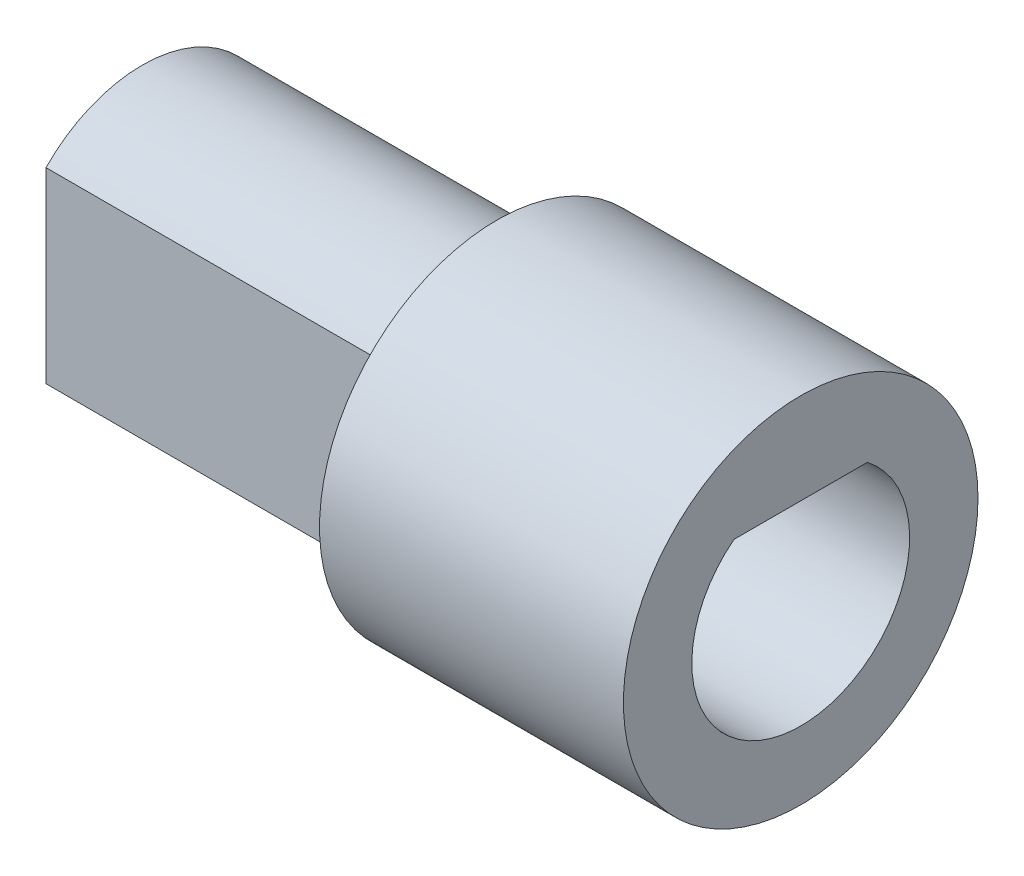
ISO-10303-21;
HEADER;
FILE_DESCRIPTION(('STEP AP214'),'2;1');
FILE_NAME('part.step','',(''),(''),'','','');
FILE_SCHEMA(('AUTOMOTIVE_DESIGN { 1 0 10303 214 1 1 1 1 }'));
ENDSEC;
DATA;
#1=APPLICATION_CONTEXT('core data for automotive mechanical design processes');
#2=APPLICATION_PROTOCOL_DEFINITION('international standard','automotive_design',2000,#1);
#3=PRODUCT_CONTEXT('',#1,'mechanical');
#4=PRODUCT('Part','Part','',(#3));
#5=PRODUCT_RELATED_PRODUCT_CATEGORY('part','',(#4));
#6=PRODUCT_DEFINITION_FORMATION('','',#4);
#7=PRODUCT_DEFINITION_CONTEXT('part definition',#1,'design');
#8=PRODUCT_DEFINITION('design','',#6,#7);
#9=PRODUCT_DEFINITION_SHAPE('','',#8);
#10=(LENGTH_UNIT() NAMED_UNIT(*) SI_UNIT(.MILLI.,.METRE.));
#11=(NAMED_UNIT(*) PLANE_ANGLE_UNIT() SI_UNIT($,.RADIAN.));
#12=(NAMED_UNIT(*) SI_UNIT($,.STERADIAN.) SOLID_ANGLE_UNIT());
#13=UNCERTAINTY_MEASURE_WITH_UNIT(LENGTH_MEASURE(1.E-05),#10,'distance_accuracy_value','');
#14=(GEOMETRIC_REPRESENTATION_CONTEXT(3) GLOBAL_UNCERTAINTY_ASSIGNED_CONTEXT((#13)) GLOBAL_UNIT_ASSIGNED_CONTEXT((#10,
#11,#12)) REPRESENTATION_CONTEXT('',''));
#15=CARTESIAN_POINT('',(0.,0.,0.));
#16=DIRECTION('',(0.,0.,1.));
#17=DIRECTION('',(1.,0.,0.));
#18=AXIS2_PLACEMENT_3D('',#15,#16,#17);
#19=CARTESIAN_POINT('',(-7.,0.,0.));
#20=DIRECTION('',(1.,0.,0.));
#21=DIRECTION('',(0.,0.,-1.));
#22=AXIS2_PLACEMENT_3D('',#19,#20,#21);
#23=CYLINDRICAL_SURFACE('',#22,2.65);
#24=DIRECTION('',(1.,0.,0.));
#25=VECTOR('',#24,1.);
#26=CARTESIAN_POINT('',(-7.,1.84729532019112,1.9));
#27=LINE('',#26,#25);
#28=CARTESIAN_POINT('',(-7.,1.84729532019112,1.9));
#29=VERTEX_POINT('',#28);
#30=CARTESIAN_POINT('',(-0.5,1.84729532019112,1.9));
#31=VERTEX_POINT('',#30);
#32=EDGE_CURVE('E143',#29,#31,#27,.T.);
#33=ORIENTED_EDGE('',*,*,#32,.T.);
#34=CARTESIAN_POINT('',(-0.5,0.,0.));
#35=DIRECTION('',(1.,0.,0.));
#36=DIRECTION('',(0.,0.,-1.));
#37=AXIS2_PLACEMENT_3D('',#34,#35,#36);
#38=CIRCLE('',#37,2.65);
#39=CARTESIAN_POINT('',(-0.5,1.84729532019112,-1.9));
#40=VERTEX_POINT('',#39);
#41=EDGE_CURVE('E11',#31,#40,#38,.F.);
#42=ORIENTED_EDGE('',*,*,#41,.T.);
#43=DIRECTION('',(1.,0.,0.));
#44=VECTOR('',#43,1.);
#45=CARTESIAN_POINT('',(-7.,1.84729532019112,-1.9));
#46=LINE('',#45,#44);
#47=CARTESIAN_POINT('',(-7.,1.84729532019112,-1.9));
#48=VERTEX_POINT('',#47);
#49=EDGE_CURVE('E144',#48,#40,#46,.T.);
#50=ORIENTED_EDGE('',*,*,#49,.F.);
#51=CARTESIAN_POINT('',(-7.,0.,0.));
#52=DIRECTION('',(1.,0.,0.));
#53=DIRECTION('',(0.,0.,-1.));
#54=AXIS2_PLACEMENT_3D('',#51,#52,#53);
#55=CIRCLE('',#54,2.65);
#56=EDGE_CURVE('E128',#48,#29,#55,.T.);
#57=ORIENTED_EDGE('',*,*,#56,.T.);
#58=EDGE_LOOP('',(#33,#42,#50,#57));
#59=FACE_BOUND('',#58,.T.);
#60=ADVANCED_FACE('F33',(#59),#23,.T.);
#61=CARTESIAN_POINT('',(-7.,1.84729532019112,-1.9));
#62=DIRECTION('',(0.,0.,-1.));
#63=DIRECTION('',(-1.,0.,0.));
#64=AXIS2_PLACEMENT_3D('',#61,#62,#63);
#65=PLANE('',#64);
#66=ORIENTED_EDGE('',*,*,#49,.T.);
#67=DIRECTION('',(0.,1.,0.));
#68=VECTOR('',#67,1.);
#69=CARTESIAN_POINT('',(-0.5,1.84729532019112,-1.9));
#70=LINE('',#69,#68);
#71=CARTESIAN_POINT('',(-0.5,-1.84729532019112,-1.9));
#72=VERTEX_POINT('',#71);
#73=EDGE_CURVE('E162',#40,#72,#70,.F.);
#74=ORIENTED_EDGE('',*,*,#73,.T.);
#75=DIRECTION('',(1.,0.,0.));
#76=VECTOR('',#75,1.);
#77=CARTESIAN_POINT('',(-7.,-1.84729532019112,-1.9));
#78=LINE('',#77,#76);
#79=CARTESIAN_POINT('',(-7.,-1.84729532019112,-1.9));
#80=VERTEX_POINT('',#79);
#81=EDGE_CURVE('E148',#80,#72,#78,.T.);
#82=ORIENTED_EDGE('',*,*,#81,.F.);
#83=DIRECTION('',(0.,1.,0.));
#84=VECTOR('',#83,1.);
#85=CARTESIAN_POINT('',(-7.,1.84729532019112,-1.9));
#86=LINE('',#85,#84);
#87=EDGE_CURVE('E140',#80,#48,#86,.T.);
#88=ORIENTED_EDGE('',*,*,#87,.T.);
#89=EDGE_LOOP('',(#66,#74,#82,#88));
#90=FACE_BOUND('',#89,.T.);
#91=ADVANCED_FACE('F211',(#90),#65,.T.);
#92=CARTESIAN_POINT('',(-7.,0.,0.));
#93=DIRECTION('',(1.,0.,0.));
#94=DIRECTION('',(0.,0.,-1.));
#95=AXIS2_PLACEMENT_3D('',#92,#93,#94);
#96=CYLINDRICAL_SURFACE('',#95,2.65);
#97=ORIENTED_EDGE('',*,*,#81,.T.);
#98=CARTESIAN_POINT('',(-0.5,0.,0.));
#99=DIRECTION('',(1.,0.,0.));
#100=DIRECTION('',(0.,0.,-1.));
#101=AXIS2_PLACEMENT_3D('',#98,#99,#100);
#102=CIRCLE('',#101,2.65);
#103=CARTESIAN_POINT('',(-0.5,-1.84729532019112,1.9));
#104=VERTEX_POINT('',#103);
#105=EDGE_CURVE('E165',#72,#104,#102,.F.);
#106=ORIENTED_EDGE('',*,*,#105,.T.);
#107=DIRECTION('',(1.,0.,0.));
#108=VECTOR('',#107,1.);
#109=CARTESIAN_POINT('',(-7.,-1.84729532019112,1.9));
#110=LINE('',#109,#108);
#111=CARTESIAN_POINT('',(-7.,-1.84729532019112,1.9));
#112=VERTEX_POINT('',#111);
#113=EDGE_CURVE('E151',#112,#104,#110,.T.);
#114=ORIENTED_EDGE('',*,*,#113,.F.);
#115=CARTESIAN_POINT('',(-7.,0.,0.));
#116=DIRECTION('',(1.,0.,0.));
#117=DIRECTION('',(0.,0.,-1.));
#118=AXIS2_PLACEMENT_3D('',#115,#116,#117);
#119=CIRCLE('',#118,2.65);
#120=EDGE_CURVE('E137',#112,#80,#119,.T.);
#121=ORIENTED_EDGE('',*,*,#120,.T.);
#122=EDGE_LOOP('',(#97,#106,#114,#121));
#123=FACE_BOUND('',#122,.T.);
#124=ADVANCED_FACE('F212',(#123),#96,.T.);
#125=CARTESIAN_POINT('',(-7.,1.84729532019112,1.9));
#126=DIRECTION('',(0.,0.,1.));
#127=DIRECTION('',(1.,0.,0.));
#128=AXIS2_PLACEMENT_3D('',#125,#126,#127);
#129=PLANE('',#128);
#130=ORIENTED_EDGE('',*,*,#113,.T.);
#131=DIRECTION('',(0.,-1.,0.));
#132=VECTOR('',#131,1.);
#133=CARTESIAN_POINT('',(-0.5,1.84729532019112,1.9));
#134=LINE('',#133,#132);
#135=EDGE_CURVE('E47',#104,#31,#134,.F.);
#136=ORIENTED_EDGE('',*,*,#135,.T.);
#137=ORIENTED_EDGE('',*,*,#32,.F.);
#138=DIRECTION('',(0.,-1.,0.));
#139=VECTOR('',#138,1.);
#140=CARTESIAN_POINT('',(-7.,1.84729532019112,1.9));
#141=LINE('',#140,#139);
#142=EDGE_CURVE('E134',#29,#112,#141,.T.);
#143=ORIENTED_EDGE('',*,*,#142,.T.);
#144=EDGE_LOOP('',(#130,#136,#137,#143));
#145=FACE_BOUND('',#144,.T.);
#146=ADVANCED_FACE('F240',(#145),#129,.T.);
#147=CARTESIAN_POINT('',(-7.,0.,0.));
#148=DIRECTION('',(1.,0.,0.));
#149=DIRECTION('',(0.,0.,-1.));
#150=AXIS2_PLACEMENT_3D('',#147,#148,#149);
#151=PLANE('',#150);
#152=ORIENTED_EDGE('',*,*,#56,.F.);
#153=ORIENTED_EDGE('',*,*,#87,.F.);
#154=ORIENTED_EDGE('',*,*,#120,.F.);
#155=ORIENTED_EDGE('',*,*,#142,.F.);
#156=EDGE_LOOP('',(#152,#153,#154,#155));
#157=FACE_BOUND('',#156,.T.);
#158=ADVANCED_FACE('F218',(#157),#151,.F.);
#159=CARTESIAN_POINT('',(0.,0.,0.));
#160=DIRECTION('',(1.,0.,0.));
#161=DIRECTION('',(0.,0.,-1.));
#162=AXIS2_PLACEMENT_3D('',#159,#160,#161);
#163=PLANE('',#162);
#164=CARTESIAN_POINT('',(0.,0.,0.));
#165=DIRECTION('',(1.,0.,0.));
#166=DIRECTION('',(0.,0.,-1.));
#167=AXIS2_PLACEMENT_3D('',#164,#165,#166);
#168=CIRCLE('',#167,3.15);
#169=CARTESIAN_POINT('',(0.,-2.04022057631032,2.4));
#170=VERTEX_POINT('',#169);
#171=CARTESIAN_POINT('',(0.,-2.04022057631032,-2.4));
#172=VERTEX_POINT('',#171);
#173=EDGE_CURVE('E157',#170,#172,#168,.T.);
#174=ORIENTED_EDGE('',*,*,#173,.T.);
#175=DIRECTION('',(0.,1.,0.));
#176=VECTOR('',#175,1.);
#177=CARTESIAN_POINT('',(0.,0.,-2.4));
#178=LINE('',#177,#176);
#179=CARTESIAN_POINT('',(0.,2.04022057631032,-2.4));
#180=VERTEX_POINT('',#179);
#181=EDGE_CURVE('E159',#172,#180,#178,.T.);
#182=ORIENTED_EDGE('',*,*,#181,.T.);
#183=CARTESIAN_POINT('',(0.,0.,0.));
#184=DIRECTION('',(1.,0.,0.));
#185=DIRECTION('',(0.,0.,-1.));
#186=AXIS2_PLACEMENT_3D('',#183,#184,#185);
#187=CIRCLE('',#186,3.15);
#188=CARTESIAN_POINT('',(0.,2.04022057631032,2.4));
#189=VERTEX_POINT('',#188);
#190=EDGE_CURVE('E147',#180,#189,#187,.T.);
#191=ORIENTED_EDGE('',*,*,#190,.T.);
#192=DIRECTION('',(0.,-1.,0.));
#193=VECTOR('',#192,1.);
#194=CARTESIAN_POINT('',(0.,0.,2.4));
#195=LINE('',#194,#193);
#196=EDGE_CURVE('E155',#189,#170,#195,.T.);
#197=ORIENTED_EDGE('',*,*,#196,.T.);
#198=EDGE_LOOP('',(#174,#182,#191,#197));
#199=FACE_BOUND('',#198,.T.);
#200=CARTESIAN_POINT('',(0.,0.,0.));
#201=DIRECTION('',(1.,0.,0.));
#202=DIRECTION('',(0.,0.,-1.));
#203=AXIS2_PLACEMENT_3D('',#200,#201,#202);
#204=CIRCLE('',#203,3.5);
#205=CARTESIAN_POINT('',(0.,0.,-3.5));
#206=VERTEX_POINT('',#205);
#207=EDGE_CURVE('E129',#206,#206,#204,.T.);
#208=ORIENTED_EDGE('',*,*,#207,.F.);
#209=EDGE_LOOP('',(#208));
#210=FACE_BOUND('',#209,.T.);
#211=ADVANCED_FACE('F222',(#199,#210),#163,.F.);
#212=CARTESIAN_POINT('',(6.,0.,0.));
#213=DIRECTION('',(-1.,0.,0.));
#214=DIRECTION('',(0.,0.,1.));
#215=AXIS2_PLACEMENT_3D('',#212,#213,#214);
#216=CYLINDRICAL_SURFACE('',#215,3.5);
#217=CARTESIAN_POINT('',(6.,0.,0.));
#218=DIRECTION('',(1.,0.,0.));
#219=DIRECTION('',(0.,0.,-1.));
#220=AXIS2_PLACEMENT_3D('',#217,#218,#219);
#221=CIRCLE('',#220,3.5);
#222=CARTESIAN_POINT('',(6.,0.,-3.5));
#223=VERTEX_POINT('',#222);
#224=EDGE_CURVE('E125',#223,#223,#221,.T.);
#225=ORIENTED_EDGE('',*,*,#224,.F.);
#226=EDGE_LOOP('',(#225));
#227=FACE_BOUND('',#226,.T.);
#228=ORIENTED_EDGE('',*,*,#207,.T.);
#229=EDGE_LOOP('',(#228));
#230=FACE_BOUND('',#229,.T.);
#231=ADVANCED_FACE('F231',(#227,#230),#216,.T.);
#232=CARTESIAN_POINT('',(6.,0.,0.));
#233=DIRECTION('',(1.,0.,0.));
#234=DIRECTION('',(0.,0.,-1.));
#235=AXIS2_PLACEMENT_3D('',#232,#233,#234);
#236=PLANE('',#235);
#237=CARTESIAN_POINT('',(6.,0.,0.));
#238=DIRECTION('',(1.,0.,0.));
#239=DIRECTION('',(0.,0.,-1.));
#240=AXIS2_PLACEMENT_3D('',#237,#238,#239);
#241=CIRCLE('',#240,2.15);
#242=CARTESIAN_POINT('',(6.,1.7,1.31624465810882));
#243=VERTEX_POINT('',#242);
#244=CARTESIAN_POINT('',(6.,1.7,-1.31624465810882));
#245=VERTEX_POINT('',#244);
#246=EDGE_CURVE('E55',#243,#245,#241,.T.);
#247=ORIENTED_EDGE('',*,*,#246,.F.);
#248=DIRECTION('',(0.,0.,1.));
#249=VECTOR('',#248,1.);
#250=CARTESIAN_POINT('',(6.,1.7,1.31624465810882));
#251=LINE('',#250,#249);
#252=EDGE_CURVE('E116',#245,#243,#251,.T.);
#253=ORIENTED_EDGE('',*,*,#252,.F.);
#254=EDGE_LOOP('',(#247,#253));
#255=FACE_BOUND('',#254,.T.);
#256=ORIENTED_EDGE('',*,*,#224,.T.);
#257=EDGE_LOOP('',(#256));
#258=FACE_BOUND('',#257,.T.);
#259=ADVANCED_FACE('F226',(#255,#258),#236,.T.);
#260=CARTESIAN_POINT('',(-0.5,0.,2.4));
#261=DIRECTION('',(0.,-1.,0.));
#262=DIRECTION('',(0.,0.,-1.));
#263=AXIS2_PLACEMENT_3D('',#260,#261,#262);
#264=CYLINDRICAL_SURFACE('',#263,0.5);
#265=CARTESIAN_POINT('',(-0.5,1.84729532019112,1.9));
#266=CARTESIAN_POINT('',(-0.473313299022205,1.84728099192078,1.89997037218295));
#267=CARTESIAN_POINT('',(-0.446646865629517,1.84816191215664,1.9021344661516));
#268=CARTESIAN_POINT('',(-0.394169339908651,1.85160200274379,1.91061654198202));
#269=CARTESIAN_POINT('',(-0.36835602889857,1.85415638877057,1.91692268214877));
#270=CARTESIAN_POINT('',(-0.318246984437916,1.86083128190166,1.93345511544516));
#271=CARTESIAN_POINT('',(-0.293950783441736,1.86495130370436,1.9436801938262));
#272=CARTESIAN_POINT('',(-0.247467436875275,1.8745731808725,1.96766759561641));
#273=CARTESIAN_POINT('',(-0.225281143808752,1.8800755915466,1.98143134056773));
#274=CARTESIAN_POINT('',(-0.182846848627034,1.89244383561732,2.01253625988208));
#275=CARTESIAN_POINT('',(-0.162683884474139,1.89934775247858,2.02997805365335));
#276=CARTESIAN_POINT('',(-0.125542800850984,1.91415093797732,2.06761270037761));
#277=CARTESIAN_POINT('',(-0.108565794348544,1.92205055284239,2.08780651047061));
#278=CARTESIAN_POINT('',(-0.0770523696468303,1.93916734983726,2.13186128372807));
#279=CARTESIAN_POINT('',(-0.0627640663230558,1.94843778064198,2.1558789315621));
#280=CARTESIAN_POINT('',(-0.0384323189516263,1.96754809981078,2.2057695404265));
#281=CARTESIAN_POINT('',(-0.0283895659525638,1.97738808058444,2.23164280269435));
#282=CARTESIAN_POINT('',(-0.0139796544551096,1.99576003930094,2.28032503712598));
#283=CARTESIAN_POINT('',(-0.00896115666311815,2.00424914064896,2.30296122192505));
#284=CARTESIAN_POINT('',(-0.00210851708425217,2.02127667251313,2.34865813525806));
#285=CARTESIAN_POINT('',(-0.000268088516354063,2.02981497203937,2.37171793422004));
#286=CARTESIAN_POINT('',(-9.04590209242298E-06,2.03894214138096,2.39652309187162));
#287=CARTESIAN_POINT('',(2.34085730246771E-08,2.03958152104385,2.39826157490041));
#288=CARTESIAN_POINT('',(0.,2.04022057631032,2.4));
#289=B_SPLINE_CURVE_WITH_KNOTS('',3,(#265,#266,#267,#268,#269,#270,#271,#272,#273,#274,#275,
#276,#277,#278,#279,#280,#281,#282,#283,#284,#285,#286,#287,#288),.UNSPECIFIED.,.F.,.F.,(4,2,2,
2,2,2,2,2,2,2,2,4),(0.,0.0799265424749896,0.159625571774669,0.239299916814884,0.319006318532275,
0.401270296432231,0.483562958773993,0.571514646980536,0.65948064558405,0.733359977388135,
0.807092994714623,0.812649950240695),.UNSPECIFIED.);
#290=EDGE_CURVE('E190',#31,#189,#289,.T.);
#291=ORIENTED_EDGE('',*,*,#290,.F.);
#292=ORIENTED_EDGE('',*,*,#135,.F.);
#293=CARTESIAN_POINT('',(-0.5,-1.84729532019112,1.9));
#294=CARTESIAN_POINT('',(-0.473313299022205,-1.84728099192078,1.89997037218295));
#295=CARTESIAN_POINT('',(-0.446646865629517,-1.84816191215664,1.9021344661516));
#296=CARTESIAN_POINT('',(-0.394169339908651,-1.85160200274379,1.91061654198202));
#297=CARTESIAN_POINT('',(-0.36835602889857,-1.85415638877057,1.91692268214877));
#298=CARTESIAN_POINT('',(-0.318246984437916,-1.86083128190166,1.93345511544516));
#299=CARTESIAN_POINT('',(-0.293950783441736,-1.86495130370436,1.9436801938262));
#300=CARTESIAN_POINT('',(-0.247467436875275,-1.8745731808725,1.96766759561641));
#301=CARTESIAN_POINT('',(-0.225281143808752,-1.8800755915466,1.98143134056773));
#302=CARTESIAN_POINT('',(-0.182846848627034,-1.89244383561732,2.01253625988208));
#303=CARTESIAN_POINT('',(-0.162683884474139,-1.89934775247858,2.02997805365335));
#304=CARTESIAN_POINT('',(-0.125542800850984,-1.91415093797732,2.06761270037761));
#305=CARTESIAN_POINT('',(-0.108565794348544,-1.92205055284239,2.08780651047061));
#306=CARTESIAN_POINT('',(-0.0770523696468303,-1.93916734983726,2.13186128372807));
#307=CARTESIAN_POINT('',(-0.0627640663230558,-1.94843778064198,2.1558789315621));
#308=CARTESIAN_POINT('',(-0.0384323189516263,-1.96754809981078,2.2057695404265));
#309=CARTESIAN_POINT('',(-0.0283895659525638,-1.97738808058444,2.23164280269435));
#310=CARTESIAN_POINT('',(-0.0139796544551096,-1.99576003930094,2.28032503712598));
#311=CARTESIAN_POINT('',(-0.00896115666311815,-2.00424914064896,2.30296122192505));
#312=CARTESIAN_POINT('',(-0.00210851708425217,-2.02127667251313,2.34865813525806));
#313=CARTESIAN_POINT('',(-0.000268088516354063,-2.02981497203937,2.37171793422004));
#314=CARTESIAN_POINT('',(-9.04590209242298E-06,-2.03894214138096,2.39652309187162));
#315=CARTESIAN_POINT('',(2.34085730246771E-08,-2.03958152104385,2.39826157490041));
#316=CARTESIAN_POINT('',(0.,-2.04022057631032,2.4));
#317=B_SPLINE_CURVE_WITH_KNOTS('',3,(#293,#294,#295,#296,#297,#298,#299,#300,#301,#302,#303,
#304,#305,#306,#307,#308,#309,#310,#311,#312,#313,#314,#315,#316),.UNSPECIFIED.,.F.,.F.,(4,2,2,
2,2,2,2,2,2,2,2,4),(0.,0.0799265424749896,0.159625571774669,0.239299916814884,0.319006318532275,
0.401270296432231,0.483562958773993,0.571514646980536,0.65948064558405,0.733359977388135,
0.807092994714623,0.812649950240695),.UNSPECIFIED.);
#318=EDGE_CURVE('E38',#170,#104,#317,.F.);
#319=ORIENTED_EDGE('',*,*,#318,.F.);
#320=ORIENTED_EDGE('',*,*,#196,.F.);
#321=EDGE_LOOP('',(#291,#292,#319,#320));
#322=FACE_BOUND('',#321,.T.);
#323=ADVANCED_FACE('F35',(#322),#264,.F.);
#324=CARTESIAN_POINT('',(-0.5,0.,0.));
#325=DIRECTION('',(1.,0.,0.));
#326=DIRECTION('',(0.,0.,-1.));
#327=AXIS2_PLACEMENT_3D('',#324,#325,#326);
#328=TOROIDAL_SURFACE('',#327,3.15,0.5);
#329=ORIENTED_EDGE('',*,*,#318,.T.);
#330=ORIENTED_EDGE('',*,*,#105,.F.);
#331=CARTESIAN_POINT('',(-0.5,-1.84729532019112,-1.9));
#332=CARTESIAN_POINT('',(-0.473313299022205,-1.84728099192078,-1.89997037218295));
#333=CARTESIAN_POINT('',(-0.446646865629517,-1.84816191215664,-1.9021344661516));
#334=CARTESIAN_POINT('',(-0.394169339908652,-1.85160200274379,-1.91061654198202));
#335=CARTESIAN_POINT('',(-0.36835602889857,-1.85415638877057,-1.91692268214877));
#336=CARTESIAN_POINT('',(-0.318246984437916,-1.86083128190166,-1.93345511544516));
#337=CARTESIAN_POINT('',(-0.293950783441736,-1.86495130370436,-1.9436801938262));
#338=CARTESIAN_POINT('',(-0.247467436875275,-1.8745731808725,-1.96766759561641));
#339=CARTESIAN_POINT('',(-0.225281143808752,-1.8800755915466,-1.98143134056773));
#340=CARTESIAN_POINT('',(-0.182846848627034,-1.89244383561732,-2.01253625988208));
#341=CARTESIAN_POINT('',(-0.162683884474139,-1.89934775247858,-2.02997805365335));
#342=CARTESIAN_POINT('',(-0.125542800850984,-1.91415093797732,-2.06761270037761));
#343=CARTESIAN_POINT('',(-0.108565794348544,-1.92205055284239,-2.08780651047061));
#344=CARTESIAN_POINT('',(-0.0770523696468304,-1.93916734983726,-2.13186128372807));
#345=CARTESIAN_POINT('',(-0.0627640663230558,-1.94843778064198,-2.1558789315621));
#346=CARTESIAN_POINT('',(-0.0384323189516262,-1.96754809981078,-2.2057695404265));
#347=CARTESIAN_POINT('',(-0.0283895659525637,-1.97738808058444,-2.23164280269435));
#348=CARTESIAN_POINT('',(-0.0139796544551096,-1.99576003930094,-2.28032503712598));
#349=CARTESIAN_POINT('',(-0.00896115666311833,-2.00424914064896,-2.30296122192505));
#350=CARTESIAN_POINT('',(-0.00210851708425226,-2.02127667251313,-2.34865813525805));
#351=CARTESIAN_POINT('',(-0.000268088516354005,-2.02981497203937,-2.37171793422004));
#352=CARTESIAN_POINT('',(-9.04590209241384E-06,-2.03894214138096,-2.39652309187162));
#353=CARTESIAN_POINT('',(2.34085730293216E-08,-2.03958152104385,-2.39826157490041));
#354=CARTESIAN_POINT('',(0.,-2.04022057631032,-2.4));
#355=B_SPLINE_CURVE_WITH_KNOTS('',3,(#331,#332,#333,#334,#335,#336,#337,#338,#339,#340,#341,
#342,#343,#344,#345,#346,#347,#348,#349,#350,#351,#352,#353,#354),.UNSPECIFIED.,.F.,.F.,(4,2,2,
2,2,2,2,2,2,2,2,4),(0.,0.0799265424749896,0.159625571774669,0.239299916814884,0.319006318532275,
0.401270296432231,0.483562958773993,0.571514646980536,0.65948064558405,0.733359977388134,
0.807092994714622,0.812649950240695),.UNSPECIFIED.);
#356=EDGE_CURVE('E175',#172,#72,#355,.F.);
#357=ORIENTED_EDGE('',*,*,#356,.F.);
#358=ORIENTED_EDGE('',*,*,#173,.F.);
#359=EDGE_LOOP('',(#329,#330,#357,#358));
#360=FACE_BOUND('',#359,.T.);
#361=ADVANCED_FACE('F186',(#360),#328,.F.);
#362=CARTESIAN_POINT('',(-0.5,0.,0.));
#363=DIRECTION('',(1.,0.,0.));
#364=DIRECTION('',(0.,0.,-1.));
#365=AXIS2_PLACEMENT_3D('',#362,#363,#364);
#366=TOROIDAL_SURFACE('',#365,3.15,0.5);
#367=ORIENTED_EDGE('',*,*,#290,.T.);
#368=ORIENTED_EDGE('',*,*,#190,.F.);
#369=CARTESIAN_POINT('',(-0.5,1.84729532019112,-1.9));
#370=CARTESIAN_POINT('',(-0.473313299022205,1.84728099192078,-1.89997037218295));
#371=CARTESIAN_POINT('',(-0.446646865629517,1.84816191215664,-1.9021344661516));
#372=CARTESIAN_POINT('',(-0.394169339908652,1.85160200274379,-1.91061654198202));
#373=CARTESIAN_POINT('',(-0.36835602889857,1.85415638877057,-1.91692268214877));
#374=CARTESIAN_POINT('',(-0.318246984437916,1.86083128190166,-1.93345511544516));
#375=CARTESIAN_POINT('',(-0.293950783441736,1.86495130370436,-1.9436801938262));
#376=CARTESIAN_POINT('',(-0.247467436875275,1.8745731808725,-1.96766759561641));
#377=CARTESIAN_POINT('',(-0.225281143808752,1.8800755915466,-1.98143134056773));
#378=CARTESIAN_POINT('',(-0.182846848627034,1.89244383561732,-2.01253625988208));
#379=CARTESIAN_POINT('',(-0.162683884474139,1.89934775247857,-2.02997805365335));
#380=CARTESIAN_POINT('',(-0.125542800850984,1.91415093797732,-2.06761270037761));
#381=CARTESIAN_POINT('',(-0.108565794348544,1.92205055284239,-2.08780651047061));
#382=CARTESIAN_POINT('',(-0.0770523696468304,1.93916734983726,-2.13186128372807));
#383=CARTESIAN_POINT('',(-0.0627640663230558,1.94843778064198,-2.1558789315621));
#384=CARTESIAN_POINT('',(-0.0384323189516262,1.96754809981078,-2.2057695404265));
#385=CARTESIAN_POINT('',(-0.0283895659525637,1.97738808058444,-2.23164280269435));
#386=CARTESIAN_POINT('',(-0.0139796544551096,1.99576003930094,-2.28032503712598));
#387=CARTESIAN_POINT('',(-0.00896115666311825,2.00424914064896,-2.30296122192505));
#388=CARTESIAN_POINT('',(-0.00210851708425228,2.02127667251313,-2.34865813525805));
#389=CARTESIAN_POINT('',(-0.000268088516354151,2.02981497203937,-2.37171793422004));
#390=CARTESIAN_POINT('',(-9.04590209243509E-06,2.03894214138096,-2.39652309187162));
#391=CARTESIAN_POINT('',(2.34085730181934E-08,2.03958152104385,-2.39826157490041));
#392=CARTESIAN_POINT('',(0.,2.04022057631032,-2.4));
#393=B_SPLINE_CURVE_WITH_KNOTS('',3,(#369,#370,#371,#372,#373,#374,#375,#376,#377,#378,#379,
#380,#381,#382,#383,#384,#385,#386,#387,#388,#389,#390,#391,#392),.UNSPECIFIED.,.F.,.F.,(4,2,2,
2,2,2,2,2,2,2,2,4),(0.,0.0799265424749895,0.159625571774669,0.239299916814884,0.319006318532275,
0.401270296432231,0.483562958773993,0.571514646980536,0.65948064558405,0.733359977388134,
0.807092994714622,0.812649950240695),.UNSPECIFIED.);
#394=EDGE_CURVE('E123',#40,#180,#393,.T.);
#395=ORIENTED_EDGE('',*,*,#394,.F.);
#396=ORIENTED_EDGE('',*,*,#41,.F.);
#397=EDGE_LOOP('',(#367,#368,#395,#396));
#398=FACE_BOUND('',#397,.T.);
#399=ADVANCED_FACE('F183',(#398),#366,.F.);
#400=CARTESIAN_POINT('',(-0.5,0.,-2.4));
#401=DIRECTION('',(0.,1.,0.));
#402=DIRECTION('',(0.,0.,1.));
#403=AXIS2_PLACEMENT_3D('',#400,#401,#402);
#404=CYLINDRICAL_SURFACE('',#403,0.5);
#405=ORIENTED_EDGE('',*,*,#356,.T.);
#406=ORIENTED_EDGE('',*,*,#73,.F.);
#407=ORIENTED_EDGE('',*,*,#394,.T.);
#408=ORIENTED_EDGE('',*,*,#181,.F.);
#409=EDGE_LOOP('',(#405,#406,#407,#408));
#410=FACE_BOUND('',#409,.T.);
#411=ADVANCED_FACE('F180',(#410),#404,.F.);
#412=CARTESIAN_POINT('',(1.,0.,0.));
#413=DIRECTION('',(1.,0.,0.));
#414=DIRECTION('',(0.,0.,-1.));
#415=AXIS2_PLACEMENT_3D('',#412,#413,#414);
#416=CYLINDRICAL_SURFACE('',#415,2.15);
#417=ORIENTED_EDGE('',*,*,#246,.T.);
#418=DIRECTION('',(1.,0.,0.));
#419=VECTOR('',#418,1.);
#420=CARTESIAN_POINT('',(1.,1.7,-1.31624465810882));
#421=LINE('',#420,#419);
#422=CARTESIAN_POINT('',(1.,1.7,-1.31624465810882));
#423=VERTEX_POINT('',#422);
#424=EDGE_CURVE('E102',#423,#245,#421,.T.);
#425=ORIENTED_EDGE('',*,*,#424,.F.);
#426=CARTESIAN_POINT('',(1.,0.,0.));
#427=DIRECTION('',(1.,0.,0.));
#428=DIRECTION('',(0.,0.,-1.));
#429=AXIS2_PLACEMENT_3D('',#426,#427,#428);
#430=CIRCLE('',#429,2.15);
#431=CARTESIAN_POINT('',(1.,1.7,1.31624465810882));
#432=VERTEX_POINT('',#431);
#433=EDGE_CURVE('E105',#432,#423,#430,.T.);
#434=ORIENTED_EDGE('',*,*,#433,.F.);
#435=DIRECTION('',(1.,0.,0.));
#436=VECTOR('',#435,1.);
#437=CARTESIAN_POINT('',(1.,1.7,1.31624465810882));
#438=LINE('',#437,#436);
#439=EDGE_CURVE('E111',#432,#243,#438,.T.);
#440=ORIENTED_EDGE('',*,*,#439,.T.);
#441=EDGE_LOOP('',(#417,#425,#434,#440));
#442=FACE_BOUND('',#441,.T.);
#443=ADVANCED_FACE('F104',(#442),#416,.F.);
#444=CARTESIAN_POINT('',(1.,1.7,1.31624465810882));
#445=DIRECTION('',(0.,1.,0.));
#446=DIRECTION('',(0.,0.,1.));
#447=AXIS2_PLACEMENT_3D('',#444,#445,#446);
#448=PLANE('',#447);
#449=ORIENTED_EDGE('',*,*,#252,.T.);
#450=ORIENTED_EDGE('',*,*,#439,.F.);
#451=DIRECTION('',(0.,0.,1.));
#452=VECTOR('',#451,1.);
#453=CARTESIAN_POINT('',(1.,1.7,1.31624465810882));
#454=LINE('',#453,#452);
#455=EDGE_CURVE('E112',#423,#432,#454,.T.);
#456=ORIENTED_EDGE('',*,*,#455,.F.);
#457=ORIENTED_EDGE('',*,*,#424,.T.);
#458=EDGE_LOOP('',(#449,#450,#456,#457));
#459=FACE_BOUND('',#458,.T.);
#460=ADVANCED_FACE('F118',(#459),#448,.F.);
#461=CARTESIAN_POINT('',(1.,0.,0.));
#462=DIRECTION('',(1.,0.,0.));
#463=DIRECTION('',(0.,0.,-1.));
#464=AXIS2_PLACEMENT_3D('',#461,#462,#463);
#465=PLANE('',#464);
#466=ORIENTED_EDGE('',*,*,#433,.T.);
#467=ORIENTED_EDGE('',*,*,#455,.T.);
#468=EDGE_LOOP('',(#466,#467));
#469=FACE_BOUND('',#468,.T.);
#470=ADVANCED_FACE('F115',(#469),#465,.T.);
#471=CLOSED_SHELL('',(#60,#91,#124,#146,#158,#211,#231,#259,#323,#361,#399,#411,#443,#460,#470));
#472=MANIFOLD_SOLID_BREP('B2',#471);
#473=ADVANCED_BREP_SHAPE_REPRESENTATION('',(#18,#472),#14);
#474=SHAPE_DEFINITION_REPRESENTATION(#9,#473);
ENDSEC;
END-ISO-10303-21;
